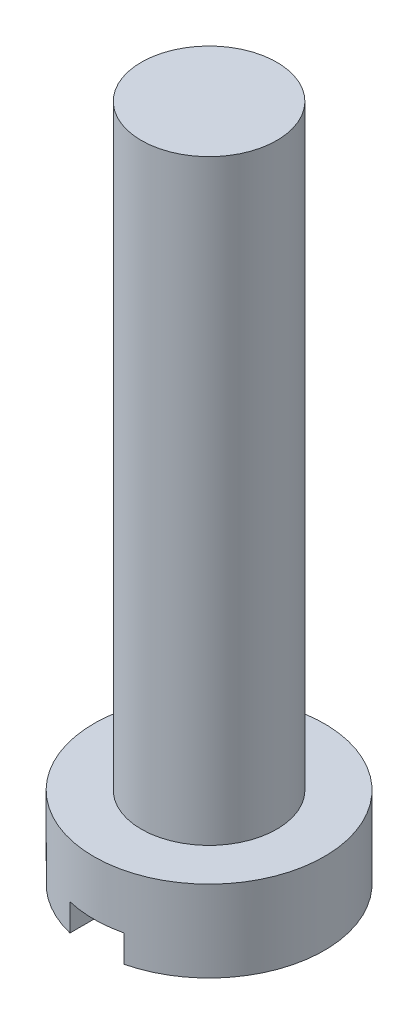
ISO-10303-21;
HEADER;
FILE_DESCRIPTION(('STEP AP214'),'2;1');
FILE_NAME('part.step','',(''),(''),'','','');
FILE_SCHEMA(('AUTOMOTIVE_DESIGN { 1 0 10303 214 1 1 1 1 }'));
ENDSEC;
DATA;
#1=APPLICATION_CONTEXT('core data for automotive mechanical design processes');
#2=APPLICATION_PROTOCOL_DEFINITION('international standard','automotive_design',2000,#1);
#3=PRODUCT_CONTEXT('',#1,'mechanical');
#4=PRODUCT('Part','Part','',(#3));
#5=PRODUCT_RELATED_PRODUCT_CATEGORY('part','',(#4));
#6=PRODUCT_DEFINITION_FORMATION('','',#4);
#7=PRODUCT_DEFINITION_CONTEXT('part definition',#1,'design');
#8=PRODUCT_DEFINITION('design','',#6,#7);
#9=PRODUCT_DEFINITION_SHAPE('','',#8);
#10=(LENGTH_UNIT() NAMED_UNIT(*) SI_UNIT(.MILLI.,.METRE.));
#11=(NAMED_UNIT(*) PLANE_ANGLE_UNIT() SI_UNIT($,.RADIAN.));
#12=(NAMED_UNIT(*) SI_UNIT($,.STERADIAN.) SOLID_ANGLE_UNIT());
#13=UNCERTAINTY_MEASURE_WITH_UNIT(LENGTH_MEASURE(1.E-05),#10,'distance_accuracy_value','');
#14=(GEOMETRIC_REPRESENTATION_CONTEXT(3) GLOBAL_UNCERTAINTY_ASSIGNED_CONTEXT((#13)) GLOBAL_UNIT_ASSIGNED_CONTEXT((#10,
#11,#12)) REPRESENTATION_CONTEXT('',''));
#15=CARTESIAN_POINT('',(0.,0.,0.));
#16=DIRECTION('',(0.,0.,1.));
#17=DIRECTION('',(1.,0.,0.));
#18=AXIS2_PLACEMENT_3D('',#15,#16,#17);
#19=CARTESIAN_POINT('',(0.,0.,0.));
#20=DIRECTION('',(0.,1.,0.));
#21=DIRECTION('',(0.,0.,1.));
#22=AXIS2_PLACEMENT_3D('',#19,#20,#21);
#23=PLANE('',#22);
#24=CARTESIAN_POINT('',(0.,0.,0.));
#25=DIRECTION('',(0.,1.,0.));
#26=DIRECTION('',(0.,0.,1.));
#27=AXIS2_PLACEMENT_3D('',#24,#25,#26);
#28=CIRCLE('',#27,4.25);
#29=CARTESIAN_POINT('',(1.,0.,4.13067791046458));
#30=VERTEX_POINT('',#29);
#31=CARTESIAN_POINT('',(1.,0.,-4.13067791046458));
#32=VERTEX_POINT('',#31);
#33=EDGE_CURVE('E94',#30,#32,#28,.T.);
#34=ORIENTED_EDGE('',*,*,#33,.F.);
#35=DIRECTION('',(0.,0.,1.));
#36=VECTOR('',#35,1.);
#37=CARTESIAN_POINT('',(1.,0.,8.));
#38=LINE('',#37,#36);
#39=EDGE_CURVE('E89',#32,#30,#38,.T.);
#40=ORIENTED_EDGE('',*,*,#39,.F.);
#41=EDGE_LOOP('',(#34,#40));
#42=FACE_BOUND('',#41,.T.);
#43=ADVANCED_FACE('F35',(#42),#23,.F.);
#44=CARTESIAN_POINT('',(0.,3.,0.));
#45=DIRECTION('',(0.,1.,0.));
#46=DIRECTION('',(0.,0.,1.));
#47=AXIS2_PLACEMENT_3D('',#44,#45,#46);
#48=PLANE('',#47);
#49=CARTESIAN_POINT('',(0.,3.,0.));
#50=DIRECTION('',(0.,1.,0.));
#51=DIRECTION('',(0.,0.,1.));
#52=AXIS2_PLACEMENT_3D('',#49,#50,#51);
#53=CIRCLE('',#52,4.25);
#54=CARTESIAN_POINT('',(0.,3.,4.25));
#55=VERTEX_POINT('',#54);
#56=EDGE_CURVE('E97',#55,#55,#53,.T.);
#57=ORIENTED_EDGE('',*,*,#56,.T.);
#58=EDGE_LOOP('',(#57));
#59=FACE_BOUND('',#58,.T.);
#60=CARTESIAN_POINT('',(0.,3.,0.));
#61=DIRECTION('',(0.,1.,0.));
#62=DIRECTION('',(0.,0.,1.));
#63=AXIS2_PLACEMENT_3D('',#60,#61,#62);
#64=CIRCLE('',#63,2.5);
#65=CARTESIAN_POINT('',(0.,3.,2.5));
#66=VERTEX_POINT('',#65);
#67=EDGE_CURVE('E95',#66,#66,#64,.T.);
#68=ORIENTED_EDGE('',*,*,#67,.F.);
#69=EDGE_LOOP('',(#68));
#70=FACE_BOUND('',#69,.T.);
#71=ADVANCED_FACE('F118',(#59,#70),#48,.T.);
#72=CARTESIAN_POINT('',(-1.,0.,-4.13067791046458));
#73=VERTEX_POINT('',#72);
#74=CARTESIAN_POINT('',(-1.,0.,4.13067791046458));
#75=VERTEX_POINT('',#74);
#76=EDGE_CURVE('E88',#73,#75,#28,.T.);
#77=ORIENTED_EDGE('',*,*,#76,.F.);
#78=DIRECTION('',(0.,0.,-1.));
#79=VECTOR('',#78,1.);
#80=CARTESIAN_POINT('',(-1.,0.,-8.));
#81=LINE('',#80,#79);
#82=EDGE_CURVE('E77',#75,#73,#81,.T.);
#83=ORIENTED_EDGE('',*,*,#82,.F.);
#84=EDGE_LOOP('',(#77,#83));
#85=FACE_BOUND('',#84,.T.);
#86=ADVANCED_FACE('F87',(#85),#23,.F.);
#87=CARTESIAN_POINT('',(0.,3.,0.));
#88=DIRECTION('',(0.,-1.,0.));
#89=DIRECTION('',(0.,0.,-1.));
#90=AXIS2_PLACEMENT_3D('',#87,#88,#89);
#91=CYLINDRICAL_SURFACE('',#90,4.25);
#92=ORIENTED_EDGE('',*,*,#33,.T.);
#93=DIRECTION('',(0.,-1.,0.));
#94=VECTOR('',#93,1.);
#95=CARTESIAN_POINT('',(1.,3.,-4.13067791046458));
#96=LINE('',#95,#94);
#97=CARTESIAN_POINT('',(1.,1.,-4.13067791046458));
#98=VERTEX_POINT('',#97);
#99=EDGE_CURVE('E11',#32,#98,#96,.F.);
#100=ORIENTED_EDGE('',*,*,#99,.T.);
#101=CARTESIAN_POINT('',(0.,1.,0.));
#102=DIRECTION('',(0.,1.,0.));
#103=DIRECTION('',(0.,0.,1.));
#104=AXIS2_PLACEMENT_3D('',#101,#102,#103);
#105=CIRCLE('',#104,4.25);
#106=CARTESIAN_POINT('',(-1.,1.,-4.13067791046458));
#107=VERTEX_POINT('',#106);
#108=EDGE_CURVE('E103',#98,#107,#105,.T.);
#109=ORIENTED_EDGE('',*,*,#108,.T.);
#110=DIRECTION('',(0.,-1.,0.));
#111=VECTOR('',#110,1.);
#112=CARTESIAN_POINT('',(-1.,3.,-4.13067791046458));
#113=LINE('',#112,#111);
#114=EDGE_CURVE('E43',#107,#73,#113,.T.);
#115=ORIENTED_EDGE('',*,*,#114,.T.);
#116=ORIENTED_EDGE('',*,*,#76,.T.);
#117=DIRECTION('',(0.,-1.,0.));
#118=VECTOR('',#117,1.);
#119=CARTESIAN_POINT('',(-1.,3.,4.13067791046458));
#120=LINE('',#119,#118);
#121=CARTESIAN_POINT('',(-1.,1.,4.13067791046458));
#122=VERTEX_POINT('',#121);
#123=EDGE_CURVE('E74',#75,#122,#120,.F.);
#124=ORIENTED_EDGE('',*,*,#123,.T.);
#125=CARTESIAN_POINT('',(1.,1.,4.13067791046458));
#126=VERTEX_POINT('',#125);
#127=EDGE_CURVE('E83',#122,#126,#105,.T.);
#128=ORIENTED_EDGE('',*,*,#127,.T.);
#129=DIRECTION('',(0.,-1.,0.));
#130=VECTOR('',#129,1.);
#131=CARTESIAN_POINT('',(1.,3.,4.13067791046458));
#132=LINE('',#131,#130);
#133=EDGE_CURVE('E82',#126,#30,#132,.T.);
#134=ORIENTED_EDGE('',*,*,#133,.T.);
#135=EDGE_LOOP('',(#92,#100,#109,#115,#116,#124,#128,#134));
#136=FACE_BOUND('',#135,.T.);
#137=ORIENTED_EDGE('',*,*,#56,.F.);
#138=EDGE_LOOP('',(#137));
#139=FACE_BOUND('',#138,.T.);
#140=ADVANCED_FACE('F37',(#136,#139),#91,.T.);
#141=CARTESIAN_POINT('',(0.,25.,0.));
#142=DIRECTION('',(0.,-1.,0.));
#143=DIRECTION('',(0.,0.,-1.));
#144=AXIS2_PLACEMENT_3D('',#141,#142,#143);
#145=CYLINDRICAL_SURFACE('',#144,2.5);
#146=ORIENTED_EDGE('',*,*,#67,.T.);
#147=EDGE_LOOP('',(#146));
#148=FACE_BOUND('',#147,.T.);
#149=CARTESIAN_POINT('',(0.,25.,0.));
#150=DIRECTION('',(0.,1.,0.));
#151=DIRECTION('',(0.,0.,1.));
#152=AXIS2_PLACEMENT_3D('',#149,#150,#151);
#153=CIRCLE('',#152,2.5);
#154=CARTESIAN_POINT('',(0.,25.,2.5));
#155=VERTEX_POINT('',#154);
#156=EDGE_CURVE('E99',#155,#155,#153,.T.);
#157=ORIENTED_EDGE('',*,*,#156,.F.);
#158=EDGE_LOOP('',(#157));
#159=FACE_BOUND('',#158,.T.);
#160=ADVANCED_FACE('F128',(#148,#159),#145,.T.);
#161=CARTESIAN_POINT('',(0.,25.,0.));
#162=DIRECTION('',(0.,1.,0.));
#163=DIRECTION('',(0.,0.,1.));
#164=AXIS2_PLACEMENT_3D('',#161,#162,#163);
#165=PLANE('',#164);
#166=ORIENTED_EDGE('',*,*,#156,.T.);
#167=EDGE_LOOP('',(#166));
#168=FACE_BOUND('',#167,.T.);
#169=ADVANCED_FACE('F132',(#168),#165,.T.);
#170=CARTESIAN_POINT('',(1.,1.,8.));
#171=DIRECTION('',(1.,0.,0.));
#172=DIRECTION('',(0.,0.,-1.));
#173=AXIS2_PLACEMENT_3D('',#170,#171,#172);
#174=PLANE('',#173);
#175=DIRECTION('',(0.,0.,1.));
#176=VECTOR('',#175,1.);
#177=CARTESIAN_POINT('',(1.,1.,8.));
#178=LINE('',#177,#176);
#179=EDGE_CURVE('E50',#98,#126,#178,.T.);
#180=ORIENTED_EDGE('',*,*,#179,.F.);
#181=ORIENTED_EDGE('',*,*,#99,.F.);
#182=ORIENTED_EDGE('',*,*,#39,.T.);
#183=ORIENTED_EDGE('',*,*,#133,.F.);
#184=EDGE_LOOP('',(#180,#181,#182,#183));
#185=FACE_BOUND('',#184,.T.);
#186=ADVANCED_FACE('F108',(#185),#174,.F.);
#187=CARTESIAN_POINT('',(-1.,1.,-8.));
#188=DIRECTION('',(-1.,0.,0.));
#189=DIRECTION('',(0.,0.,1.));
#190=AXIS2_PLACEMENT_3D('',#187,#188,#189);
#191=PLANE('',#190);
#192=DIRECTION('',(0.,0.,-1.));
#193=VECTOR('',#192,1.);
#194=CARTESIAN_POINT('',(-1.,1.,0.));
#195=LINE('',#194,#193);
#196=EDGE_CURVE('E78',#122,#107,#195,.T.);
#197=ORIENTED_EDGE('',*,*,#196,.F.);
#198=ORIENTED_EDGE('',*,*,#123,.F.);
#199=ORIENTED_EDGE('',*,*,#82,.T.);
#200=ORIENTED_EDGE('',*,*,#114,.F.);
#201=EDGE_LOOP('',(#197,#198,#199,#200));
#202=FACE_BOUND('',#201,.T.);
#203=ADVANCED_FACE('F76',(#202),#191,.F.);
#204=CARTESIAN_POINT('',(0.,1.,0.));
#205=DIRECTION('',(0.,1.,0.));
#206=DIRECTION('',(0.,0.,1.));
#207=AXIS2_PLACEMENT_3D('',#204,#205,#206);
#208=PLANE('',#207);
#209=ORIENTED_EDGE('',*,*,#179,.T.);
#210=ORIENTED_EDGE('',*,*,#127,.F.);
#211=ORIENTED_EDGE('',*,*,#196,.T.);
#212=ORIENTED_EDGE('',*,*,#108,.F.);
#213=EDGE_LOOP('',(#209,#210,#211,#212));
#214=FACE_BOUND('',#213,.T.);
#215=ADVANCED_FACE('F106',(#214),#208,.F.);
#216=CLOSED_SHELL('',(#43,#71,#86,#140,#160,#169,#186,#203,#215));
#217=MANIFOLD_SOLID_BREP('B2',#216);
#218=ADVANCED_BREP_SHAPE_REPRESENTATION('',(#18,#217),#14);
#219=SHAPE_DEFINITION_REPRESENTATION(#9,#218);
ENDSEC;
END-ISO-10303-21;
